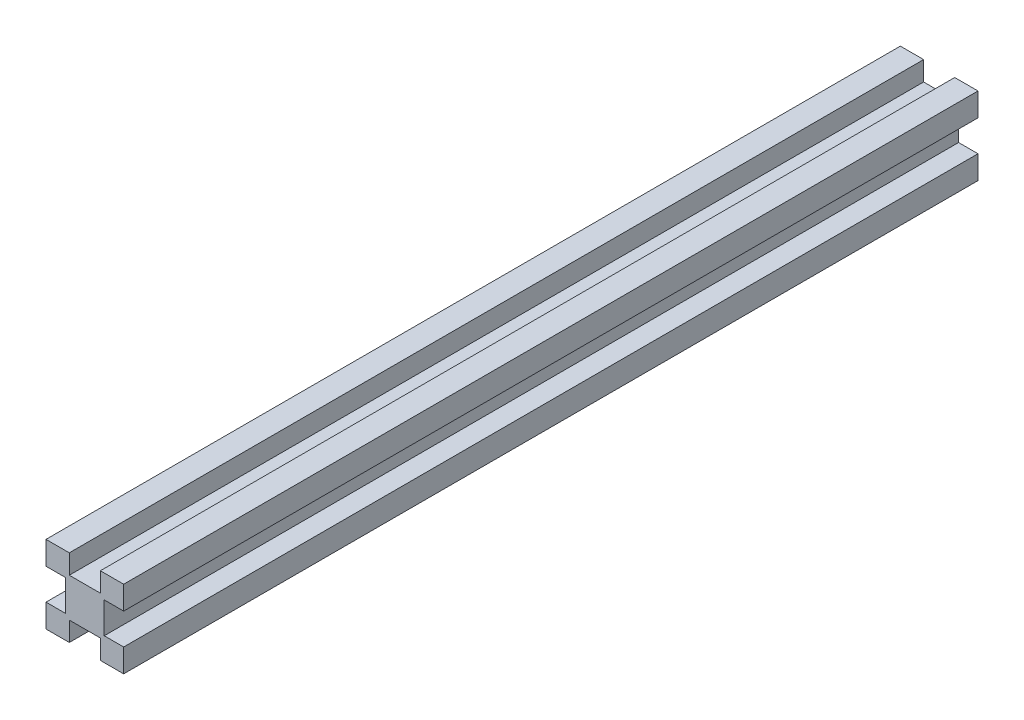
ISO-10303-21;
HEADER;
FILE_DESCRIPTION(('STEP AP214'),'2;1');
FILE_NAME('part.step','',(''),(''),'','','');
FILE_SCHEMA(('AUTOMOTIVE_DESIGN { 1 0 10303 214 1 1 1 1 }'));
ENDSEC;
DATA;
#1=APPLICATION_CONTEXT('core data for automotive mechanical design processes');
#2=APPLICATION_PROTOCOL_DEFINITION('international standard','automotive_design',2000,#1);
#3=PRODUCT_CONTEXT('',#1,'mechanical');
#4=PRODUCT('Part','Part','',(#3));
#5=PRODUCT_RELATED_PRODUCT_CATEGORY('part','',(#4));
#6=PRODUCT_DEFINITION_FORMATION('','',#4);
#7=PRODUCT_DEFINITION_CONTEXT('part definition',#1,'design');
#8=PRODUCT_DEFINITION('design','',#6,#7);
#9=PRODUCT_DEFINITION_SHAPE('','',#8);
#10=(LENGTH_UNIT() NAMED_UNIT(*) SI_UNIT(.MILLI.,.METRE.));
#11=(NAMED_UNIT(*) PLANE_ANGLE_UNIT() SI_UNIT($,.RADIAN.));
#12=(NAMED_UNIT(*) SI_UNIT($,.STERADIAN.) SOLID_ANGLE_UNIT());
#13=UNCERTAINTY_MEASURE_WITH_UNIT(LENGTH_MEASURE(1.E-05),#10,'distance_accuracy_value','');
#14=(GEOMETRIC_REPRESENTATION_CONTEXT(3) GLOBAL_UNCERTAINTY_ASSIGNED_CONTEXT((#13)) GLOBAL_UNIT_ASSIGNED_CONTEXT((#10,
#11,#12)) REPRESENTATION_CONTEXT('',''));
#15=CARTESIAN_POINT('',(0.,0.,0.));
#16=DIRECTION('',(0.,0.,1.));
#17=DIRECTION('',(1.,0.,0.));
#18=AXIS2_PLACEMENT_3D('',#15,#16,#17);
#19=CARTESIAN_POINT('',(-3.5325550493546,14.5416666666667,220.));
#20=DIRECTION('',(-1.,0.,0.));
#21=DIRECTION('',(0.,-1.,0.));
#22=AXIS2_PLACEMENT_3D('',#19,#20,#21);
#23=PLANE('',#22);
#24=DIRECTION('',(0.,1.,0.));
#25=VECTOR('',#24,1.);
#26=CARTESIAN_POINT('',(-3.5325550493546,14.5416666666667,0.));
#27=LINE('',#26,#25);
#28=CARTESIAN_POINT('',(-3.5325550493546,-5.45833333333333,0.));
#29=VERTEX_POINT('',#28);
#30=CARTESIAN_POINT('',(-3.5325550493546,0.541666666666671,0.));
#31=VERTEX_POINT('',#30);
#32=EDGE_CURVE('E226',#29,#31,#27,.T.);
#33=ORIENTED_EDGE('',*,*,#32,.T.);
#34=DIRECTION('',(0.,0.,1.));
#35=VECTOR('',#34,1.);
#36=CARTESIAN_POINT('',(-3.5325550493546,0.541666666666671,-100.));
#37=LINE('',#36,#35);
#38=CARTESIAN_POINT('',(-3.5325550493546,0.541666666666671,220.));
#39=VERTEX_POINT('',#38);
#40=EDGE_CURVE('E350',#31,#39,#37,.T.);
#41=ORIENTED_EDGE('',*,*,#40,.T.);
#42=DIRECTION('',(0.,1.,0.));
#43=VECTOR('',#42,1.);
#44=CARTESIAN_POINT('',(-3.5325550493546,14.5416666666667,220.));
#45=LINE('',#44,#43);
#46=CARTESIAN_POINT('',(-3.5325550493546,-5.45833333333333,220.));
#47=VERTEX_POINT('',#46);
#48=EDGE_CURVE('E385',#47,#39,#45,.T.);
#49=ORIENTED_EDGE('',*,*,#48,.F.);
#50=DIRECTION('',(0.,0.,-1.));
#51=VECTOR('',#50,1.);
#52=CARTESIAN_POINT('',(-3.5325550493546,-5.45833333333333,220.));
#53=LINE('',#52,#51);
#54=EDGE_CURVE('E225',#47,#29,#53,.T.);
#55=ORIENTED_EDGE('',*,*,#54,.T.);
#56=EDGE_LOOP('',(#33,#41,#49,#55));
#57=FACE_BOUND('',#56,.T.);
#58=ADVANCED_FACE('F45',(#57),#23,.F.);
#59=CARTESIAN_POINT('',(-23.5325550493546,14.5416666666667,220.));
#60=DIRECTION('',(0.,-1.,0.));
#61=DIRECTION('',(0.,0.,-1.));
#62=AXIS2_PLACEMENT_3D('',#59,#60,#61);
#63=PLANE('',#62);
#64=DIRECTION('',(-1.,0.,0.));
#65=VECTOR('',#64,1.);
#66=CARTESIAN_POINT('',(-23.5325550493546,14.5416666666667,220.));
#67=LINE('',#66,#65);
#68=CARTESIAN_POINT('',(-17.5325550493546,14.5416666666667,220.));
#69=VERTEX_POINT('',#68);
#70=CARTESIAN_POINT('',(-23.5325550493546,14.5416666666667,220.));
#71=VERTEX_POINT('',#70);
#72=EDGE_CURVE('E218',#69,#71,#67,.T.);
#73=ORIENTED_EDGE('',*,*,#72,.F.);
#74=DIRECTION('',(0.,0.,1.));
#75=VECTOR('',#74,1.);
#76=CARTESIAN_POINT('',(-17.5325550493546,14.5416666666667,-100.));
#77=LINE('',#76,#75);
#78=CARTESIAN_POINT('',(-17.5325550493546,14.5416666666667,0.));
#79=VERTEX_POINT('',#78);
#80=EDGE_CURVE('E325',#79,#69,#77,.T.);
#81=ORIENTED_EDGE('',*,*,#80,.F.);
#82=DIRECTION('',(-1.,0.,0.));
#83=VECTOR('',#82,1.);
#84=CARTESIAN_POINT('',(-23.5325550493546,14.5416666666667,0.));
#85=LINE('',#84,#83);
#86=CARTESIAN_POINT('',(-23.5325550493546,14.5416666666667,0.));
#87=VERTEX_POINT('',#86);
#88=EDGE_CURVE('E230',#79,#87,#85,.T.);
#89=ORIENTED_EDGE('',*,*,#88,.T.);
#90=DIRECTION('',(0.,0.,-1.));
#91=VECTOR('',#90,1.);
#92=CARTESIAN_POINT('',(-23.5325550493546,14.5416666666667,220.));
#93=LINE('',#92,#91);
#94=EDGE_CURVE('E252',#71,#87,#93,.T.);
#95=ORIENTED_EDGE('',*,*,#94,.F.);
#96=EDGE_LOOP('',(#73,#81,#89,#95));
#97=FACE_BOUND('',#96,.T.);
#98=ADVANCED_FACE('F418',(#97),#63,.F.);
#99=CARTESIAN_POINT('',(-23.5325550493546,14.5416666666667,220.));
#100=DIRECTION('',(1.,0.,0.));
#101=DIRECTION('',(0.,1.,0.));
#102=AXIS2_PLACEMENT_3D('',#99,#100,#101);
#103=PLANE('',#102);
#104=DIRECTION('',(0.,-1.,0.));
#105=VECTOR('',#104,1.);
#106=CARTESIAN_POINT('',(-23.5325550493546,14.5416666666667,0.));
#107=LINE('',#106,#105);
#108=CARTESIAN_POINT('',(-23.5325550493546,8.54166666666667,0.));
#109=VERTEX_POINT('',#108);
#110=EDGE_CURVE('E237',#87,#109,#107,.T.);
#111=ORIENTED_EDGE('',*,*,#110,.T.);
#112=DIRECTION('',(0.,0.,1.));
#113=VECTOR('',#112,1.);
#114=CARTESIAN_POINT('',(-23.5325550493546,8.54166666666667,-100.));
#115=LINE('',#114,#113);
#116=CARTESIAN_POINT('',(-23.5325550493546,8.54166666666667,220.));
#117=VERTEX_POINT('',#116);
#118=EDGE_CURVE('E308',#109,#117,#115,.T.);
#119=ORIENTED_EDGE('',*,*,#118,.T.);
#120=DIRECTION('',(0.,-1.,0.));
#121=VECTOR('',#120,1.);
#122=CARTESIAN_POINT('',(-23.5325550493546,14.5416666666667,220.));
#123=LINE('',#122,#121);
#124=EDGE_CURVE('E210',#71,#117,#123,.T.);
#125=ORIENTED_EDGE('',*,*,#124,.F.);
#126=ORIENTED_EDGE('',*,*,#94,.T.);
#127=EDGE_LOOP('',(#111,#119,#125,#126));
#128=FACE_BOUND('',#127,.T.);
#129=ADVANCED_FACE('F422',(#128),#103,.F.);
#130=CARTESIAN_POINT('',(-23.5325550493546,-5.45833333333333,220.));
#131=DIRECTION('',(0.,1.,0.));
#132=DIRECTION('',(0.,0.,1.));
#133=AXIS2_PLACEMENT_3D('',#130,#131,#132);
#134=PLANE('',#133);
#135=DIRECTION('',(1.,0.,0.));
#136=VECTOR('',#135,1.);
#137=CARTESIAN_POINT('',(-23.5325550493546,-5.45833333333333,220.));
#138=LINE('',#137,#136);
#139=CARTESIAN_POINT('',(-9.5325550493546,-5.45833333333333,220.));
#140=VERTEX_POINT('',#139);
#141=EDGE_CURVE('E216',#140,#47,#138,.T.);
#142=ORIENTED_EDGE('',*,*,#141,.F.);
#143=DIRECTION('',(0.,0.,1.));
#144=VECTOR('',#143,1.);
#145=CARTESIAN_POINT('',(-9.5325550493546,-5.45833333333333,-100.));
#146=LINE('',#145,#144);
#147=CARTESIAN_POINT('',(-9.5325550493546,-5.45833333333333,0.));
#148=VERTEX_POINT('',#147);
#149=EDGE_CURVE('E371',#148,#140,#146,.T.);
#150=ORIENTED_EDGE('',*,*,#149,.F.);
#151=DIRECTION('',(1.,0.,0.));
#152=VECTOR('',#151,1.);
#153=CARTESIAN_POINT('',(-23.5325550493546,-5.45833333333333,0.));
#154=LINE('',#153,#152);
#155=EDGE_CURVE('E241',#148,#29,#154,.T.);
#156=ORIENTED_EDGE('',*,*,#155,.T.);
#157=ORIENTED_EDGE('',*,*,#54,.F.);
#158=EDGE_LOOP('',(#142,#150,#156,#157));
#159=FACE_BOUND('',#158,.T.);
#160=ADVANCED_FACE('F442',(#159),#134,.F.);
#161=CARTESIAN_POINT('',(-3.5325550493546,8.54166666666667,220.));
#162=VERTEX_POINT('',#161);
#163=CARTESIAN_POINT('',(-3.5325550493546,14.5416666666667,220.));
#164=VERTEX_POINT('',#163);
#165=EDGE_CURVE('E246',#162,#164,#45,.T.);
#166=ORIENTED_EDGE('',*,*,#165,.F.);
#167=DIRECTION('',(0.,0.,1.));
#168=VECTOR('',#167,1.);
#169=CARTESIAN_POINT('',(-3.5325550493546,8.54166666666667,-100.));
#170=LINE('',#169,#168);
#171=CARTESIAN_POINT('',(-3.5325550493546,8.54166666666667,0.));
#172=VERTEX_POINT('',#171);
#173=EDGE_CURVE('E341',#172,#162,#170,.T.);
#174=ORIENTED_EDGE('',*,*,#173,.F.);
#175=CARTESIAN_POINT('',(-3.5325550493546,14.5416666666667,0.));
#176=VERTEX_POINT('',#175);
#177=EDGE_CURVE('E231',#172,#176,#27,.T.);
#178=ORIENTED_EDGE('',*,*,#177,.T.);
#179=DIRECTION('',(0.,0.,-1.));
#180=VECTOR('',#179,1.);
#181=CARTESIAN_POINT('',(-3.5325550493546,14.5416666666667,220.));
#182=LINE('',#181,#180);
#183=EDGE_CURVE('E256',#164,#176,#182,.T.);
#184=ORIENTED_EDGE('',*,*,#183,.F.);
#185=EDGE_LOOP('',(#166,#174,#178,#184));
#186=FACE_BOUND('',#185,.T.);
#187=ADVANCED_FACE('F47',(#186),#23,.F.);
#188=CARTESIAN_POINT('',(-9.5325550493546,14.5416666666667,0.));
#189=VERTEX_POINT('',#188);
#190=EDGE_CURVE('E232',#176,#189,#85,.T.);
#191=ORIENTED_EDGE('',*,*,#190,.T.);
#192=DIRECTION('',(0.,0.,1.));
#193=VECTOR('',#192,1.);
#194=CARTESIAN_POINT('',(-9.5325550493546,14.5416666666667,-100.));
#195=LINE('',#194,#193);
#196=CARTESIAN_POINT('',(-9.5325550493546,14.5416666666667,220.));
#197=VERTEX_POINT('',#196);
#198=EDGE_CURVE('E321',#189,#197,#195,.T.);
#199=ORIENTED_EDGE('',*,*,#198,.T.);
#200=EDGE_CURVE('E211',#164,#197,#67,.T.);
#201=ORIENTED_EDGE('',*,*,#200,.F.);
#202=ORIENTED_EDGE('',*,*,#183,.T.);
#203=EDGE_LOOP('',(#191,#199,#201,#202));
#204=FACE_BOUND('',#203,.T.);
#205=ADVANCED_FACE('F401',(#204),#63,.F.);
#206=CARTESIAN_POINT('',(-23.5325550493546,0.541666666666668,220.));
#207=VERTEX_POINT('',#206);
#208=CARTESIAN_POINT('',(-23.5325550493546,-5.45833333333333,220.));
#209=VERTEX_POINT('',#208);
#210=EDGE_CURVE('E198',#207,#209,#123,.T.);
#211=ORIENTED_EDGE('',*,*,#210,.F.);
#212=DIRECTION('',(0.,0.,1.));
#213=VECTOR('',#212,1.);
#214=CARTESIAN_POINT('',(-23.5325550493546,0.541666666666668,-100.));
#215=LINE('',#214,#213);
#216=CARTESIAN_POINT('',(-23.5325550493546,0.541666666666668,0.));
#217=VERTEX_POINT('',#216);
#218=EDGE_CURVE('E181',#217,#207,#215,.T.);
#219=ORIENTED_EDGE('',*,*,#218,.F.);
#220=CARTESIAN_POINT('',(-23.5325550493546,-5.45833333333333,0.));
#221=VERTEX_POINT('',#220);
#222=EDGE_CURVE('E236',#217,#221,#107,.T.);
#223=ORIENTED_EDGE('',*,*,#222,.T.);
#224=DIRECTION('',(0.,0.,-1.));
#225=VECTOR('',#224,1.);
#226=CARTESIAN_POINT('',(-23.5325550493546,-5.45833333333333,220.));
#227=LINE('',#226,#225);
#228=EDGE_CURVE('E207',#209,#221,#227,.T.);
#229=ORIENTED_EDGE('',*,*,#228,.F.);
#230=EDGE_LOOP('',(#211,#219,#223,#229));
#231=FACE_BOUND('',#230,.T.);
#232=ADVANCED_FACE('F205',(#231),#103,.F.);
#233=CARTESIAN_POINT('',(-17.5325550493546,-5.45833333333333,0.));
#234=VERTEX_POINT('',#233);
#235=EDGE_CURVE('E242',#221,#234,#154,.T.);
#236=ORIENTED_EDGE('',*,*,#235,.T.);
#237=DIRECTION('',(0.,0.,1.));
#238=VECTOR('',#237,1.);
#239=CARTESIAN_POINT('',(-17.5325550493546,-5.45833333333333,-100.));
#240=LINE('',#239,#238);
#241=CARTESIAN_POINT('',(-17.5325550493546,-5.45833333333333,220.));
#242=VERTEX_POINT('',#241);
#243=EDGE_CURVE('E367',#234,#242,#240,.T.);
#244=ORIENTED_EDGE('',*,*,#243,.T.);
#245=EDGE_CURVE('E222',#209,#242,#138,.T.);
#246=ORIENTED_EDGE('',*,*,#245,.F.);
#247=ORIENTED_EDGE('',*,*,#228,.T.);
#248=EDGE_LOOP('',(#236,#244,#246,#247));
#249=FACE_BOUND('',#248,.T.);
#250=ADVANCED_FACE('F449',(#249),#134,.F.);
#251=CARTESIAN_POINT('',(0.,0.,220.));
#252=DIRECTION('',(0.,0.,1.));
#253=DIRECTION('',(1.,0.,0.));
#254=AXIS2_PLACEMENT_3D('',#251,#252,#253);
#255=PLANE('',#254);
#256=DIRECTION('',(-1.,0.,0.));
#257=VECTOR('',#256,1.);
#258=CARTESIAN_POINT('',(-23.5325550493546,8.54166666666667,220.));
#259=LINE('',#258,#257);
#260=CARTESIAN_POINT('',(-18.5325550493546,8.54166666666667,220.));
#261=VERTEX_POINT('',#260);
#262=EDGE_CURVE('E192',#261,#117,#259,.T.);
#263=ORIENTED_EDGE('',*,*,#262,.F.);
#264=DIRECTION('',(0.,1.,0.));
#265=VECTOR('',#264,1.);
#266=CARTESIAN_POINT('',(-18.5325550493546,8.54166666666667,220.));
#267=LINE('',#266,#265);
#268=CARTESIAN_POINT('',(-18.5325550493546,0.541666666666668,220.));
#269=VERTEX_POINT('',#268);
#270=EDGE_CURVE('E201',#269,#261,#267,.T.);
#271=ORIENTED_EDGE('',*,*,#270,.F.);
#272=DIRECTION('',(1.,0.,0.));
#273=VECTOR('',#272,1.);
#274=CARTESIAN_POINT('',(-18.5325550493546,0.541666666666668,220.));
#275=LINE('',#274,#273);
#276=EDGE_CURVE('E184',#207,#269,#275,.T.);
#277=ORIENTED_EDGE('',*,*,#276,.F.);
#278=ORIENTED_EDGE('',*,*,#210,.T.);
#279=ORIENTED_EDGE('',*,*,#245,.T.);
#280=DIRECTION('',(0.,-1.,0.));
#281=VECTOR('',#280,1.);
#282=CARTESIAN_POINT('',(-17.5325550493546,-0.458333333333331,220.));
#283=LINE('',#282,#281);
#284=CARTESIAN_POINT('',(-17.5325550493546,-0.458333333333331,220.));
#285=VERTEX_POINT('',#284);
#286=EDGE_CURVE('E380',#285,#242,#283,.T.);
#287=ORIENTED_EDGE('',*,*,#286,.F.);
#288=DIRECTION('',(-1.,0.,0.));
#289=VECTOR('',#288,1.);
#290=CARTESIAN_POINT('',(-13.5325550493546,-0.458333333333328,220.));
#291=LINE('',#290,#289);
#292=CARTESIAN_POINT('',(-9.5325550493546,-0.458333333333333,220.));
#293=VERTEX_POINT('',#292);
#294=EDGE_CURVE('E354',#293,#285,#291,.T.);
#295=ORIENTED_EDGE('',*,*,#294,.F.);
#296=DIRECTION('',(0.,1.,0.));
#297=VECTOR('',#296,1.);
#298=CARTESIAN_POINT('',(-9.5325550493546,-0.458333333333333,220.));
#299=LINE('',#298,#297);
#300=EDGE_CURVE('E366',#140,#293,#299,.T.);
#301=ORIENTED_EDGE('',*,*,#300,.F.);
#302=ORIENTED_EDGE('',*,*,#141,.T.);
#303=ORIENTED_EDGE('',*,*,#48,.T.);
#304=DIRECTION('',(1.,0.,0.));
#305=VECTOR('',#304,1.);
#306=CARTESIAN_POINT('',(-8.5325550493546,0.541666666666668,220.));
#307=LINE('',#306,#305);
#308=CARTESIAN_POINT('',(-8.5325550493546,0.541666666666668,220.));
#309=VERTEX_POINT('',#308);
#310=EDGE_CURVE('E344',#309,#39,#307,.T.);
#311=ORIENTED_EDGE('',*,*,#310,.F.);
#312=DIRECTION('',(0.,-1.,0.));
#313=VECTOR('',#312,1.);
#314=CARTESIAN_POINT('',(-8.5325550493546,8.54166666666667,220.));
#315=LINE('',#314,#313);
#316=CARTESIAN_POINT('',(-8.5325550493546,8.54166666666667,220.));
#317=VERTEX_POINT('',#316);
#318=EDGE_CURVE('E357',#317,#309,#315,.T.);
#319=ORIENTED_EDGE('',*,*,#318,.F.);
#320=DIRECTION('',(-1.,0.,0.));
#321=VECTOR('',#320,1.);
#322=CARTESIAN_POINT('',(-3.5325550493546,8.54166666666667,220.));
#323=LINE('',#322,#321);
#324=EDGE_CURVE('E331',#162,#317,#323,.T.);
#325=ORIENTED_EDGE('',*,*,#324,.F.);
#326=ORIENTED_EDGE('',*,*,#165,.T.);
#327=ORIENTED_EDGE('',*,*,#200,.T.);
#328=DIRECTION('',(0.,1.,0.));
#329=VECTOR('',#328,1.);
#330=CARTESIAN_POINT('',(-9.5325550493546,9.54166666666667,220.));
#331=LINE('',#330,#329);
#332=CARTESIAN_POINT('',(-9.5325550493546,9.54166666666667,220.));
#333=VERTEX_POINT('',#332);
#334=EDGE_CURVE('E203',#333,#197,#331,.T.);
#335=ORIENTED_EDGE('',*,*,#334,.F.);
#336=DIRECTION('',(1.,0.,0.));
#337=VECTOR('',#336,1.);
#338=CARTESIAN_POINT('',(-13.5325550493546,9.54166666666667,220.));
#339=LINE('',#338,#337);
#340=CARTESIAN_POINT('',(-17.5325550493546,9.54166666666667,220.));
#341=VERTEX_POINT('',#340);
#342=EDGE_CURVE('E320',#341,#333,#339,.T.);
#343=ORIENTED_EDGE('',*,*,#342,.F.);
#344=DIRECTION('',(0.,-1.,0.));
#345=VECTOR('',#344,1.);
#346=CARTESIAN_POINT('',(-17.5325550493546,9.54166666666667,220.));
#347=LINE('',#346,#345);
#348=EDGE_CURVE('E335',#69,#341,#347,.T.);
#349=ORIENTED_EDGE('',*,*,#348,.F.);
#350=ORIENTED_EDGE('',*,*,#72,.T.);
#351=ORIENTED_EDGE('',*,*,#124,.T.);
#352=EDGE_LOOP('',(#263,#271,#277,#278,#279,#287,#295,#301,#302,#303,#311,#319,#325,#326,#327,
#335,#343,#349,#350,#351));
#353=FACE_BOUND('',#352,.T.);
#354=ADVANCED_FACE('F196',(#353),#255,.T.);
#355=CARTESIAN_POINT('',(0.,0.,0.));
#356=DIRECTION('',(0.,0.,1.));
#357=DIRECTION('',(1.,0.,0.));
#358=AXIS2_PLACEMENT_3D('',#355,#356,#357);
#359=PLANE('',#358);
#360=DIRECTION('',(0.,1.,0.));
#361=VECTOR('',#360,1.);
#362=CARTESIAN_POINT('',(-18.5325550493546,0.,0.));
#363=LINE('',#362,#361);
#364=CARTESIAN_POINT('',(-18.5325550493546,0.541666666666668,0.));
#365=VERTEX_POINT('',#364);
#366=CARTESIAN_POINT('',(-18.5325550493546,8.54166666666667,0.));
#367=VERTEX_POINT('',#366);
#368=EDGE_CURVE('E54',#365,#367,#363,.T.);
#369=ORIENTED_EDGE('',*,*,#368,.T.);
#370=DIRECTION('',(-1.,0.,0.));
#371=VECTOR('',#370,1.);
#372=CARTESIAN_POINT('',(0.,8.54166666666667,0.));
#373=LINE('',#372,#371);
#374=EDGE_CURVE('E11',#367,#109,#373,.T.);
#375=ORIENTED_EDGE('',*,*,#374,.T.);
#376=ORIENTED_EDGE('',*,*,#110,.F.);
#377=ORIENTED_EDGE('',*,*,#88,.F.);
#378=DIRECTION('',(0.,-1.,0.));
#379=VECTOR('',#378,1.);
#380=CARTESIAN_POINT('',(-17.5325550493546,0.,0.));
#381=LINE('',#380,#379);
#382=CARTESIAN_POINT('',(-17.5325550493546,9.54166666666667,0.));
#383=VERTEX_POINT('',#382);
#384=EDGE_CURVE('E292',#79,#383,#381,.T.);
#385=ORIENTED_EDGE('',*,*,#384,.T.);
#386=DIRECTION('',(1.,0.,0.));
#387=VECTOR('',#386,1.);
#388=CARTESIAN_POINT('',(0.,9.54166666666666,0.));
#389=LINE('',#388,#387);
#390=CARTESIAN_POINT('',(-9.5325550493546,9.54166666666667,0.));
#391=VERTEX_POINT('',#390);
#392=EDGE_CURVE('E288',#383,#391,#389,.T.);
#393=ORIENTED_EDGE('',*,*,#392,.T.);
#394=DIRECTION('',(0.,1.,0.));
#395=VECTOR('',#394,1.);
#396=CARTESIAN_POINT('',(-9.5325550493546,0.,0.));
#397=LINE('',#396,#395);
#398=EDGE_CURVE('E284',#391,#189,#397,.T.);
#399=ORIENTED_EDGE('',*,*,#398,.T.);
#400=ORIENTED_EDGE('',*,*,#190,.F.);
#401=ORIENTED_EDGE('',*,*,#177,.F.);
#402=DIRECTION('',(-1.,0.,0.));
#403=VECTOR('',#402,1.);
#404=CARTESIAN_POINT('',(0.,8.54166666666668,0.));
#405=LINE('',#404,#403);
#406=CARTESIAN_POINT('',(-8.5325550493546,8.54166666666667,0.));
#407=VERTEX_POINT('',#406);
#408=EDGE_CURVE('E272',#172,#407,#405,.T.);
#409=ORIENTED_EDGE('',*,*,#408,.T.);
#410=DIRECTION('',(0.,-1.,0.));
#411=VECTOR('',#410,1.);
#412=CARTESIAN_POINT('',(-8.5325550493546,0.,0.));
#413=LINE('',#412,#411);
#414=CARTESIAN_POINT('',(-8.5325550493546,0.541666666666668,0.));
#415=VERTEX_POINT('',#414);
#416=EDGE_CURVE('E276',#407,#415,#413,.T.);
#417=ORIENTED_EDGE('',*,*,#416,.T.);
#418=DIRECTION('',(1.,0.,0.));
#419=VECTOR('',#418,1.);
#420=CARTESIAN_POINT('',(0.,0.541666666666673,0.));
#421=LINE('',#420,#419);
#422=EDGE_CURVE('E280',#415,#31,#421,.T.);
#423=ORIENTED_EDGE('',*,*,#422,.T.);
#424=ORIENTED_EDGE('',*,*,#32,.F.);
#425=ORIENTED_EDGE('',*,*,#155,.F.);
#426=DIRECTION('',(0.,1.,0.));
#427=VECTOR('',#426,1.);
#428=CARTESIAN_POINT('',(-9.5325550493546,0.,0.));
#429=LINE('',#428,#427);
#430=CARTESIAN_POINT('',(-9.5325550493546,-0.458333333333333,0.));
#431=VERTEX_POINT('',#430);
#432=EDGE_CURVE('E268',#148,#431,#429,.T.);
#433=ORIENTED_EDGE('',*,*,#432,.T.);
#434=DIRECTION('',(-1.,0.,0.));
#435=VECTOR('',#434,1.);
#436=CARTESIAN_POINT('',(0.,-0.458333333333316,0.));
#437=LINE('',#436,#435);
#438=CARTESIAN_POINT('',(-17.5325550493546,-0.458333333333331,0.));
#439=VERTEX_POINT('',#438);
#440=EDGE_CURVE('E260',#431,#439,#437,.T.);
#441=ORIENTED_EDGE('',*,*,#440,.T.);
#442=DIRECTION('',(0.,-1.,0.));
#443=VECTOR('',#442,1.);
#444=CARTESIAN_POINT('',(-17.5325550493546,0.,0.));
#445=LINE('',#444,#443);
#446=EDGE_CURVE('E264',#439,#234,#445,.T.);
#447=ORIENTED_EDGE('',*,*,#446,.T.);
#448=ORIENTED_EDGE('',*,*,#235,.F.);
#449=ORIENTED_EDGE('',*,*,#222,.F.);
#450=DIRECTION('',(1.,0.,0.));
#451=VECTOR('',#450,1.);
#452=CARTESIAN_POINT('',(0.,0.541666666666671,0.));
#453=LINE('',#452,#451);
#454=EDGE_CURVE('E187',#217,#365,#453,.T.);
#455=ORIENTED_EDGE('',*,*,#454,.T.);
#456=EDGE_LOOP('',(#369,#375,#376,#377,#385,#393,#399,#400,#401,#409,#417,#423,#424,#425,#433,
#441,#447,#448,#449,#455));
#457=FACE_BOUND('',#456,.T.);
#458=ADVANCED_FACE('F300',(#457),#359,.F.);
#459=CARTESIAN_POINT('',(-9.5325550493546,-0.458333333333333,-100.));
#460=DIRECTION('',(1.,0.,0.));
#461=DIRECTION('',(0.,0.,-1.));
#462=AXIS2_PLACEMENT_3D('',#459,#460,#461);
#463=PLANE('',#462);
#464=ORIENTED_EDGE('',*,*,#149,.T.);
#465=ORIENTED_EDGE('',*,*,#300,.T.);
#466=DIRECTION('',(0.,0.,1.));
#467=VECTOR('',#466,1.);
#468=CARTESIAN_POINT('',(-9.5325550493546,-0.458333333333333,-100.));
#469=LINE('',#468,#467);
#470=EDGE_CURVE('E374',#431,#293,#469,.T.);
#471=ORIENTED_EDGE('',*,*,#470,.F.);
#472=ORIENTED_EDGE('',*,*,#432,.F.);
#473=EDGE_LOOP('',(#464,#465,#471,#472));
#474=FACE_BOUND('',#473,.T.);
#475=ADVANCED_FACE('F474',(#474),#463,.F.);
#476=CARTESIAN_POINT('',(-17.5325550493546,-0.458333333333331,-100.));
#477=DIRECTION('',(-1.,0.,0.));
#478=DIRECTION('',(0.,0.,1.));
#479=AXIS2_PLACEMENT_3D('',#476,#477,#478);
#480=PLANE('',#479);
#481=DIRECTION('',(0.,0.,1.));
#482=VECTOR('',#481,1.);
#483=CARTESIAN_POINT('',(-17.5325550493546,-0.458333333333331,-100.));
#484=LINE('',#483,#482);
#485=EDGE_CURVE('E363',#439,#285,#484,.T.);
#486=ORIENTED_EDGE('',*,*,#485,.T.);
#487=ORIENTED_EDGE('',*,*,#286,.T.);
#488=ORIENTED_EDGE('',*,*,#243,.F.);
#489=ORIENTED_EDGE('',*,*,#446,.F.);
#490=EDGE_LOOP('',(#486,#487,#488,#489));
#491=FACE_BOUND('',#490,.T.);
#492=ADVANCED_FACE('F466',(#491),#480,.F.);
#493=CARTESIAN_POINT('',(-13.5325550493546,-0.458333333333328,-100.));
#494=DIRECTION('',(0.,1.,0.));
#495=DIRECTION('',(-1.,0.,0.));
#496=AXIS2_PLACEMENT_3D('',#493,#494,#495);
#497=PLANE('',#496);
#498=ORIENTED_EDGE('',*,*,#470,.T.);
#499=ORIENTED_EDGE('',*,*,#294,.T.);
#500=ORIENTED_EDGE('',*,*,#485,.F.);
#501=ORIENTED_EDGE('',*,*,#440,.F.);
#502=EDGE_LOOP('',(#498,#499,#500,#501));
#503=FACE_BOUND('',#502,.T.);
#504=ADVANCED_FACE('F471',(#503),#497,.F.);
#505=CARTESIAN_POINT('',(-8.5325550493546,0.541666666666668,-100.));
#506=DIRECTION('',(0.,-1.,0.));
#507=DIRECTION('',(1.,0.,0.));
#508=AXIS2_PLACEMENT_3D('',#505,#506,#507);
#509=PLANE('',#508);
#510=DIRECTION('',(0.,0.,1.));
#511=VECTOR('',#510,1.);
#512=CARTESIAN_POINT('',(-8.5325550493546,0.541666666666668,-100.));
#513=LINE('',#512,#511);
#514=EDGE_CURVE('E347',#415,#309,#513,.T.);
#515=ORIENTED_EDGE('',*,*,#514,.T.);
#516=ORIENTED_EDGE('',*,*,#310,.T.);
#517=ORIENTED_EDGE('',*,*,#40,.F.);
#518=ORIENTED_EDGE('',*,*,#422,.F.);
#519=EDGE_LOOP('',(#515,#516,#517,#518));
#520=FACE_BOUND('',#519,.T.);
#521=ADVANCED_FACE('F483',(#520),#509,.F.);
#522=CARTESIAN_POINT('',(-8.5325550493546,8.54166666666667,-100.));
#523=DIRECTION('',(-1.,0.,0.));
#524=DIRECTION('',(0.,-1.,0.));
#525=AXIS2_PLACEMENT_3D('',#522,#523,#524);
#526=PLANE('',#525);
#527=DIRECTION('',(0.,0.,1.));
#528=VECTOR('',#527,1.);
#529=CARTESIAN_POINT('',(-8.5325550493546,8.54166666666667,-100.));
#530=LINE('',#529,#528);
#531=EDGE_CURVE('E69',#407,#317,#530,.T.);
#532=ORIENTED_EDGE('',*,*,#531,.T.);
#533=ORIENTED_EDGE('',*,*,#318,.T.);
#534=ORIENTED_EDGE('',*,*,#514,.F.);
#535=ORIENTED_EDGE('',*,*,#416,.F.);
#536=EDGE_LOOP('',(#532,#533,#534,#535));
#537=FACE_BOUND('',#536,.T.);
#538=ADVANCED_FACE('F486',(#537),#526,.F.);
#539=CARTESIAN_POINT('',(-3.5325550493546,8.54166666666667,-100.));
#540=DIRECTION('',(0.,1.,0.));
#541=DIRECTION('',(-1.,0.,0.));
#542=AXIS2_PLACEMENT_3D('',#539,#540,#541);
#543=PLANE('',#542);
#544=ORIENTED_EDGE('',*,*,#173,.T.);
#545=ORIENTED_EDGE('',*,*,#324,.T.);
#546=ORIENTED_EDGE('',*,*,#531,.F.);
#547=ORIENTED_EDGE('',*,*,#408,.F.);
#548=EDGE_LOOP('',(#544,#545,#546,#547));
#549=FACE_BOUND('',#548,.T.);
#550=ADVANCED_FACE('F487',(#549),#543,.F.);
#551=CARTESIAN_POINT('',(-13.5325550493546,9.54166666666667,-100.));
#552=DIRECTION('',(0.,-1.,0.));
#553=DIRECTION('',(1.,0.,0.));
#554=AXIS2_PLACEMENT_3D('',#551,#552,#553);
#555=PLANE('',#554);
#556=DIRECTION('',(0.,0.,1.));
#557=VECTOR('',#556,1.);
#558=CARTESIAN_POINT('',(-17.5325550493546,9.54166666666667,-100.));
#559=LINE('',#558,#557);
#560=EDGE_CURVE('E328',#383,#341,#559,.T.);
#561=ORIENTED_EDGE('',*,*,#560,.T.);
#562=ORIENTED_EDGE('',*,*,#342,.T.);
#563=DIRECTION('',(0.,0.,1.));
#564=VECTOR('',#563,1.);
#565=CARTESIAN_POINT('',(-9.5325550493546,9.54166666666667,-100.));
#566=LINE('',#565,#564);
#567=EDGE_CURVE('E317',#391,#333,#566,.T.);
#568=ORIENTED_EDGE('',*,*,#567,.F.);
#569=ORIENTED_EDGE('',*,*,#392,.F.);
#570=EDGE_LOOP('',(#561,#562,#568,#569));
#571=FACE_BOUND('',#570,.T.);
#572=ADVANCED_FACE('F409',(#571),#555,.F.);
#573=CARTESIAN_POINT('',(-17.5325550493546,9.54166666666667,-100.));
#574=DIRECTION('',(-1.,0.,0.));
#575=DIRECTION('',(0.,0.,1.));
#576=AXIS2_PLACEMENT_3D('',#573,#574,#575);
#577=PLANE('',#576);
#578=ORIENTED_EDGE('',*,*,#80,.T.);
#579=ORIENTED_EDGE('',*,*,#348,.T.);
#580=ORIENTED_EDGE('',*,*,#560,.F.);
#581=ORIENTED_EDGE('',*,*,#384,.F.);
#582=EDGE_LOOP('',(#578,#579,#580,#581));
#583=FACE_BOUND('',#582,.T.);
#584=ADVANCED_FACE('F434',(#583),#577,.F.);
#585=CARTESIAN_POINT('',(-9.5325550493546,9.54166666666667,-100.));
#586=DIRECTION('',(1.,0.,0.));
#587=DIRECTION('',(0.,0.,-1.));
#588=AXIS2_PLACEMENT_3D('',#585,#586,#587);
#589=PLANE('',#588);
#590=ORIENTED_EDGE('',*,*,#567,.T.);
#591=ORIENTED_EDGE('',*,*,#334,.T.);
#592=ORIENTED_EDGE('',*,*,#198,.F.);
#593=ORIENTED_EDGE('',*,*,#398,.F.);
#594=EDGE_LOOP('',(#590,#591,#592,#593));
#595=FACE_BOUND('',#594,.T.);
#596=ADVANCED_FACE('F407',(#595),#589,.F.);
#597=CARTESIAN_POINT('',(-23.5325550493546,8.54166666666667,-100.));
#598=DIRECTION('',(0.,1.,0.));
#599=DIRECTION('',(0.,0.,1.));
#600=AXIS2_PLACEMENT_3D('',#597,#598,#599);
#601=PLANE('',#600);
#602=DIRECTION('',(0.,0.,1.));
#603=VECTOR('',#602,1.);
#604=CARTESIAN_POINT('',(-18.5325550493546,8.54166666666667,-100.));
#605=LINE('',#604,#603);
#606=EDGE_CURVE('E305',#367,#261,#605,.T.);
#607=ORIENTED_EDGE('',*,*,#606,.T.);
#608=ORIENTED_EDGE('',*,*,#262,.T.);
#609=ORIENTED_EDGE('',*,*,#118,.F.);
#610=ORIENTED_EDGE('',*,*,#374,.F.);
#611=EDGE_LOOP('',(#607,#608,#609,#610));
#612=FACE_BOUND('',#611,.T.);
#613=ADVANCED_FACE('F426',(#612),#601,.F.);
#614=CARTESIAN_POINT('',(-18.5325550493546,8.54166666666667,-100.));
#615=DIRECTION('',(1.,0.,0.));
#616=DIRECTION('',(0.,0.,-1.));
#617=AXIS2_PLACEMENT_3D('',#614,#615,#616);
#618=PLANE('',#617);
#619=DIRECTION('',(0.,0.,1.));
#620=VECTOR('',#619,1.);
#621=CARTESIAN_POINT('',(-18.5325550493546,0.541666666666668,-100.));
#622=LINE('',#621,#620);
#623=EDGE_CURVE('E61',#365,#269,#622,.T.);
#624=ORIENTED_EDGE('',*,*,#623,.T.);
#625=ORIENTED_EDGE('',*,*,#270,.T.);
#626=ORIENTED_EDGE('',*,*,#606,.F.);
#627=ORIENTED_EDGE('',*,*,#368,.F.);
#628=EDGE_LOOP('',(#624,#625,#626,#627));
#629=FACE_BOUND('',#628,.T.);
#630=ADVANCED_FACE('F304',(#629),#618,.F.);
#631=CARTESIAN_POINT('',(-18.5325550493546,0.541666666666668,-100.));
#632=DIRECTION('',(0.,-1.,0.));
#633=DIRECTION('',(1.,0.,0.));
#634=AXIS2_PLACEMENT_3D('',#631,#632,#633);
#635=PLANE('',#634);
#636=ORIENTED_EDGE('',*,*,#218,.T.);
#637=ORIENTED_EDGE('',*,*,#276,.T.);
#638=ORIENTED_EDGE('',*,*,#623,.F.);
#639=ORIENTED_EDGE('',*,*,#454,.F.);
#640=EDGE_LOOP('',(#636,#637,#638,#639));
#641=FACE_BOUND('',#640,.T.);
#642=ADVANCED_FACE('F183',(#641),#635,.F.);
#643=CLOSED_SHELL('',(#58,#98,#129,#160,#187,#205,#232,#250,#354,#458,#475,#492,#504,#521,#538,
#550,#572,#584,#596,#613,#630,#642));
#644=MANIFOLD_SOLID_BREP('B2',#643);
#645=ADVANCED_BREP_SHAPE_REPRESENTATION('',(#18,#644),#14);
#646=SHAPE_DEFINITION_REPRESENTATION(#9,#645);
ENDSEC;
END-ISO-10303-21;
